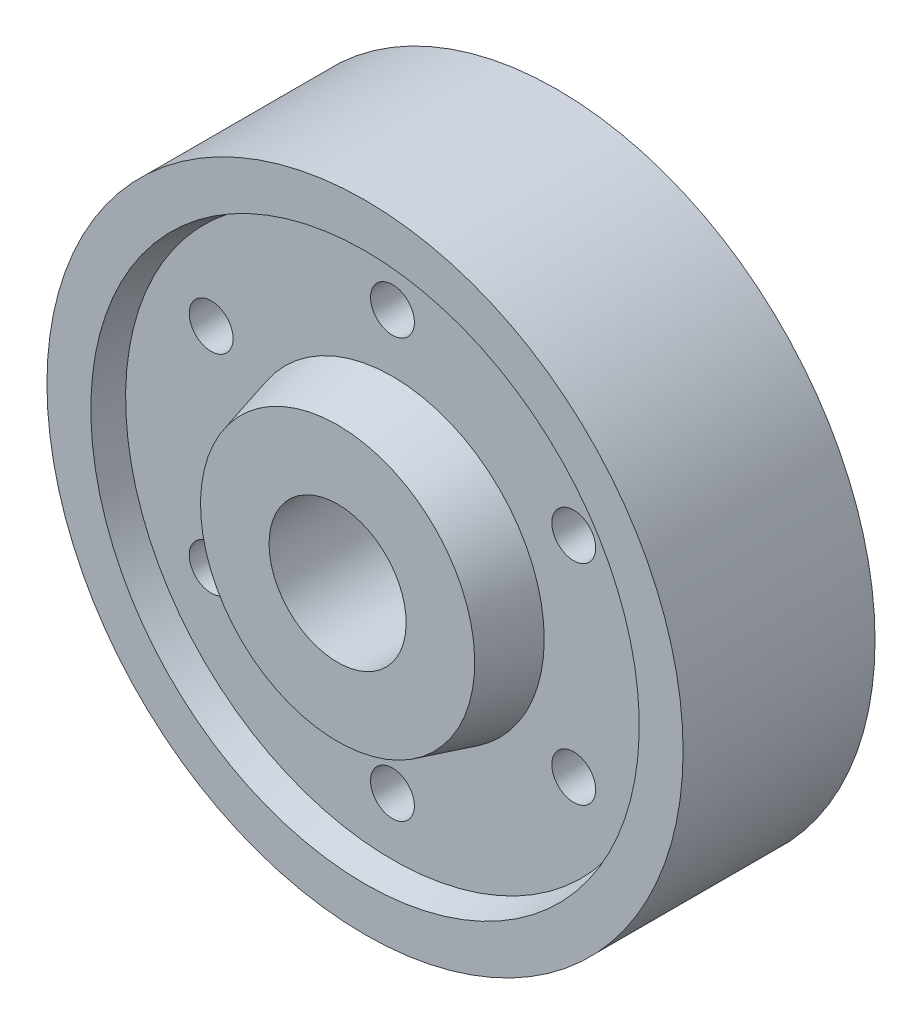
ISO-10303-21;
HEADER;
FILE_DESCRIPTION(('STEP AP214'),'2;1');
FILE_NAME('part.step','',(''),(''),'','','');
FILE_SCHEMA(('AUTOMOTIVE_DESIGN { 1 0 10303 214 1 1 1 1 }'));
ENDSEC;
DATA;
#1=APPLICATION_CONTEXT('core data for automotive mechanical design processes');
#2=APPLICATION_PROTOCOL_DEFINITION('international standard','automotive_design',2000,#1);
#3=PRODUCT_CONTEXT('',#1,'mechanical');
#4=PRODUCT('Part','Part','',(#3));
#5=PRODUCT_RELATED_PRODUCT_CATEGORY('part','',(#4));
#6=PRODUCT_DEFINITION_FORMATION('','',#4);
#7=PRODUCT_DEFINITION_CONTEXT('part definition',#1,'design');
#8=PRODUCT_DEFINITION('design','',#6,#7);
#9=PRODUCT_DEFINITION_SHAPE('','',#8);
#10=(LENGTH_UNIT() NAMED_UNIT(*) SI_UNIT(.MILLI.,.METRE.));
#11=(NAMED_UNIT(*) PLANE_ANGLE_UNIT() SI_UNIT($,.RADIAN.));
#12=(NAMED_UNIT(*) SI_UNIT($,.STERADIAN.) SOLID_ANGLE_UNIT());
#13=UNCERTAINTY_MEASURE_WITH_UNIT(LENGTH_MEASURE(1.E-05),#10,'distance_accuracy_value','');
#14=(GEOMETRIC_REPRESENTATION_CONTEXT(3) GLOBAL_UNCERTAINTY_ASSIGNED_CONTEXT((#13)) GLOBAL_UNIT_ASSIGNED_CONTEXT((#10,
#11,#12)) REPRESENTATION_CONTEXT('',''));
#15=CARTESIAN_POINT('',(0.,0.,0.));
#16=DIRECTION('',(0.,0.,1.));
#17=DIRECTION('',(1.,0.,0.));
#18=AXIS2_PLACEMENT_3D('',#15,#16,#17);
#19=CARTESIAN_POINT('',(0.,27.6794919243112,35.));
#20=DIRECTION('',(0.,0.,1.));
#21=DIRECTION('',(0.,-1.,0.));
#22=AXIS2_PLACEMENT_3D('',#19,#20,#21);
#23=PLANE('',#22);
#24=CARTESIAN_POINT('',(0.,38.1698729810778,35.));
#25=DIRECTION('',(0.,0.,1.));
#26=DIRECTION('',(1.,0.,0.));
#27=AXIS2_PLACEMENT_3D('',#24,#25,#26);
#28=CIRCLE('',#27,4.);
#29=CARTESIAN_POINT('',(4.,38.1698729810778,35.));
#30=VERTEX_POINT('',#29);
#31=EDGE_CURVE('E129',#30,#30,#28,.T.);
#32=ORIENTED_EDGE('',*,*,#31,.F.);
#33=EDGE_LOOP('',(#32));
#34=FACE_BOUND('',#33,.T.);
#35=CARTESIAN_POINT('',(-33.0560796608384,19.0849364905393,35.));
#36=DIRECTION('',(0.,0.,1.));
#37=DIRECTION('',(1.,0.,0.));
#38=AXIS2_PLACEMENT_3D('',#35,#36,#37);
#39=CIRCLE('',#38,4.);
#40=CARTESIAN_POINT('',(-29.0560796608384,19.0849364905393,35.));
#41=VERTEX_POINT('',#40);
#42=EDGE_CURVE('E133',#41,#41,#39,.T.);
#43=ORIENTED_EDGE('',*,*,#42,.F.);
#44=EDGE_LOOP('',(#43));
#45=FACE_BOUND('',#44,.T.);
#46=CARTESIAN_POINT('',(-2.66538798438892E-13,-38.1698729810778,35.));
#47=DIRECTION('',(0.,0.,1.));
#48=DIRECTION('',(1.,0.,0.));
#49=AXIS2_PLACEMENT_3D('',#46,#47,#48);
#50=CIRCLE('',#49,4.);
#51=CARTESIAN_POINT('',(3.99999999999973,-38.1698729810778,35.));
#52=VERTEX_POINT('',#51);
#53=EDGE_CURVE('E137',#52,#52,#50,.T.);
#54=ORIENTED_EDGE('',*,*,#53,.F.);
#55=EDGE_LOOP('',(#54));
#56=FACE_BOUND('',#55,.T.);
#57=CARTESIAN_POINT('',(33.0560796608386,-19.0849364905391,35.));
#58=DIRECTION('',(0.,0.,1.));
#59=DIRECTION('',(1.,0.,0.));
#60=AXIS2_PLACEMENT_3D('',#57,#58,#59);
#61=CIRCLE('',#60,4.00000000000001);
#62=CARTESIAN_POINT('',(37.0560796608386,-19.0849364905391,35.));
#63=VERTEX_POINT('',#62);
#64=EDGE_CURVE('E141',#63,#63,#61,.T.);
#65=ORIENTED_EDGE('',*,*,#64,.F.);
#66=EDGE_LOOP('',(#65));
#67=FACE_BOUND('',#66,.T.);
#68=CARTESIAN_POINT('',(33.0560796608387,19.0849364905388,35.));
#69=DIRECTION('',(0.,0.,1.));
#70=DIRECTION('',(1.,0.,0.));
#71=AXIS2_PLACEMENT_3D('',#68,#69,#70);
#72=CIRCLE('',#71,4.00000000000001);
#73=CARTESIAN_POINT('',(37.0560796608387,19.0849364905388,35.));
#74=VERTEX_POINT('',#73);
#75=EDGE_CURVE('E145',#74,#74,#72,.T.);
#76=ORIENTED_EDGE('',*,*,#75,.F.);
#77=EDGE_LOOP('',(#76));
#78=FACE_BOUND('',#77,.T.);
#79=CARTESIAN_POINT('',(-33.0560796608388,-19.0849364905386,35.));
#80=DIRECTION('',(0.,0.,1.));
#81=DIRECTION('',(1.,0.,0.));
#82=AXIS2_PLACEMENT_3D('',#79,#80,#81);
#83=CIRCLE('',#82,4.);
#84=CARTESIAN_POINT('',(-29.0560796608388,-19.0849364905386,35.));
#85=VERTEX_POINT('',#84);
#86=EDGE_CURVE('E57',#85,#85,#83,.T.);
#87=ORIENTED_EDGE('',*,*,#86,.F.);
#88=EDGE_LOOP('',(#87));
#89=FACE_BOUND('',#88,.T.);
#90=CARTESIAN_POINT('',(0.,0.,35.));
#91=DIRECTION('',(0.,0.,-1.));
#92=DIRECTION('',(0.,1.,0.));
#93=AXIS2_PLACEMENT_3D('',#90,#91,#92);
#94=CIRCLE('',#93,27.6794919243112);
#95=CARTESIAN_POINT('',(0.,27.6794919243112,35.));
#96=VERTEX_POINT('',#95);
#97=EDGE_CURVE('E70',#96,#96,#94,.T.);
#98=ORIENTED_EDGE('',*,*,#97,.T.);
#99=EDGE_LOOP('',(#98));
#100=FACE_BOUND('',#99,.T.);
#101=CARTESIAN_POINT('',(0.,0.,35.));
#102=DIRECTION('',(0.,0.,-1.));
#103=DIRECTION('',(0.,1.,0.));
#104=AXIS2_PLACEMENT_3D('',#101,#102,#103);
#105=CIRCLE('',#104,48.6602540378444);
#106=CARTESIAN_POINT('',(0.,48.6602540378444,35.));
#107=VERTEX_POINT('',#106);
#108=EDGE_CURVE('E10',#107,#107,#105,.T.);
#109=ORIENTED_EDGE('',*,*,#108,.F.);
#110=EDGE_LOOP('',(#109));
#111=FACE_BOUND('',#110,.T.);
#112=ADVANCED_FACE('F37',(#34,#45,#56,#67,#78,#89,#100,#111),#23,.T.);
#113=CARTESIAN_POINT('',(0.,0.,40.));
#114=DIRECTION('',(0.,0.,1.));
#115=DIRECTION('',(0.,-1.,0.));
#116=AXIS2_PLACEMENT_3D('',#113,#114,#115);
#117=CONICAL_SURFACE('',#116,50.,0.261799387799143);
#118=ORIENTED_EDGE('',*,*,#108,.T.);
#119=EDGE_LOOP('',(#118));
#120=FACE_BOUND('',#119,.T.);
#121=CARTESIAN_POINT('',(0.,0.,40.));
#122=DIRECTION('',(0.,0.,-1.));
#123=DIRECTION('',(0.,1.,0.));
#124=AXIS2_PLACEMENT_3D('',#121,#122,#123);
#125=CIRCLE('',#124,50.);
#126=CARTESIAN_POINT('',(0.,50.,40.));
#127=VERTEX_POINT('',#126);
#128=EDGE_CURVE('E44',#127,#127,#125,.T.);
#129=ORIENTED_EDGE('',*,*,#128,.F.);
#130=EDGE_LOOP('',(#129));
#131=FACE_BOUND('',#130,.T.);
#132=ADVANCED_FACE('F111',(#120,#131),#117,.F.);
#133=CARTESIAN_POINT('',(0.,50.,40.));
#134=DIRECTION('',(0.,0.,1.));
#135=DIRECTION('',(0.,-1.,0.));
#136=AXIS2_PLACEMENT_3D('',#133,#134,#135);
#137=PLANE('',#136);
#138=ORIENTED_EDGE('',*,*,#128,.T.);
#139=EDGE_LOOP('',(#138));
#140=FACE_BOUND('',#139,.T.);
#141=CARTESIAN_POINT('',(0.,0.,40.));
#142=DIRECTION('',(0.,0.,-1.));
#143=DIRECTION('',(0.,1.,0.));
#144=AXIS2_PLACEMENT_3D('',#141,#142,#143);
#145=CIRCLE('',#144,58.);
#146=CARTESIAN_POINT('',(0.,58.,40.));
#147=VERTEX_POINT('',#146);
#148=EDGE_CURVE('E49',#147,#147,#145,.T.);
#149=ORIENTED_EDGE('',*,*,#148,.F.);
#150=EDGE_LOOP('',(#149));
#151=FACE_BOUND('',#150,.T.);
#152=ADVANCED_FACE('F109',(#140,#151),#137,.T.);
#153=CARTESIAN_POINT('',(0.,0.,0.));
#154=DIRECTION('',(0.,0.,-1.));
#155=DIRECTION('',(0.,1.,0.));
#156=AXIS2_PLACEMENT_3D('',#153,#154,#155);
#157=CYLINDRICAL_SURFACE('',#156,58.);
#158=ORIENTED_EDGE('',*,*,#148,.T.);
#159=EDGE_LOOP('',(#158));
#160=FACE_BOUND('',#159,.T.);
#161=CARTESIAN_POINT('',(0.,0.,4.99999999999999));
#162=DIRECTION('',(0.,0.,-1.));
#163=DIRECTION('',(0.,1.,0.));
#164=AXIS2_PLACEMENT_3D('',#161,#162,#163);
#165=CIRCLE('',#164,58.);
#166=CARTESIAN_POINT('',(0.,58.,5.));
#167=VERTEX_POINT('',#166);
#168=EDGE_CURVE('E101',#167,#167,#165,.T.);
#169=ORIENTED_EDGE('',*,*,#168,.F.);
#170=EDGE_LOOP('',(#169));
#171=FACE_BOUND('',#170,.T.);
#172=ADVANCED_FACE('F106',(#160,#171),#157,.T.);
#173=CARTESIAN_POINT('',(0.,58.,5.));
#174=DIRECTION('',(0.,0.,-1.));
#175=DIRECTION('',(0.,1.,0.));
#176=AXIS2_PLACEMENT_3D('',#173,#174,#175);
#177=PLANE('',#176);
#178=ORIENTED_EDGE('',*,*,#168,.T.);
#179=EDGE_LOOP('',(#178));
#180=FACE_BOUND('',#179,.T.);
#181=CARTESIAN_POINT('',(0.,0.,4.99999999999999));
#182=DIRECTION('',(0.,0.,-1.));
#183=DIRECTION('',(0.,1.,0.));
#184=AXIS2_PLACEMENT_3D('',#181,#182,#183);
#185=CIRCLE('',#184,50.);
#186=CARTESIAN_POINT('',(0.,50.,5.));
#187=VERTEX_POINT('',#186);
#188=EDGE_CURVE('E98',#187,#187,#185,.T.);
#189=ORIENTED_EDGE('',*,*,#188,.F.);
#190=EDGE_LOOP('',(#189));
#191=FACE_BOUND('',#190,.T.);
#192=ADVANCED_FACE('F118',(#180,#191),#177,.T.);
#193=CARTESIAN_POINT('',(0.,0.,10.));
#194=DIRECTION('',(0.,0.,-1.));
#195=DIRECTION('',(0.,1.,0.));
#196=AXIS2_PLACEMENT_3D('',#193,#194,#195);
#197=CONICAL_SURFACE('',#196,48.6602540378444,0.261799387799141);
#198=ORIENTED_EDGE('',*,*,#188,.T.);
#199=EDGE_LOOP('',(#198));
#200=FACE_BOUND('',#199,.T.);
#201=CARTESIAN_POINT('',(0.,0.,10.));
#202=DIRECTION('',(0.,0.,-1.));
#203=DIRECTION('',(0.,1.,0.));
#204=AXIS2_PLACEMENT_3D('',#201,#202,#203);
#205=CIRCLE('',#204,48.6602540378444);
#206=CARTESIAN_POINT('',(0.,48.6602540378444,10.));
#207=VERTEX_POINT('',#206);
#208=EDGE_CURVE('E95',#207,#207,#205,.T.);
#209=ORIENTED_EDGE('',*,*,#208,.F.);
#210=EDGE_LOOP('',(#209));
#211=FACE_BOUND('',#210,.T.);
#212=ADVANCED_FACE('F203',(#200,#211),#197,.F.);
#213=CARTESIAN_POINT('',(0.,48.6602540378444,10.));
#214=DIRECTION('',(0.,0.,-1.));
#215=DIRECTION('',(0.,1.,0.));
#216=AXIS2_PLACEMENT_3D('',#213,#214,#215);
#217=PLANE('',#216);
#218=CARTESIAN_POINT('',(0.,38.1698729810778,10.));
#219=DIRECTION('',(0.,0.,-1.));
#220=DIRECTION('',(0.,1.,0.));
#221=AXIS2_PLACEMENT_3D('',#218,#219,#220);
#222=CIRCLE('',#221,4.);
#223=CARTESIAN_POINT('',(0.,42.1698729810778,10.));
#224=VERTEX_POINT('',#223);
#225=EDGE_CURVE('E40',#224,#224,#222,.T.);
#226=ORIENTED_EDGE('',*,*,#225,.F.);
#227=EDGE_LOOP('',(#226));
#228=FACE_BOUND('',#227,.T.);
#229=CARTESIAN_POINT('',(-33.0560796608384,19.0849364905393,10.));
#230=DIRECTION('',(0.,0.,-1.));
#231=DIRECTION('',(0.,1.,0.));
#232=AXIS2_PLACEMENT_3D('',#229,#230,#231);
#233=CIRCLE('',#232,4.);
#234=CARTESIAN_POINT('',(-33.0560796608384,23.0849364905393,10.));
#235=VERTEX_POINT('',#234);
#236=EDGE_CURVE('E65',#235,#235,#233,.T.);
#237=ORIENTED_EDGE('',*,*,#236,.F.);
#238=EDGE_LOOP('',(#237));
#239=FACE_BOUND('',#238,.T.);
#240=CARTESIAN_POINT('',(-2.66538798438892E-13,-38.1698729810778,10.));
#241=DIRECTION('',(0.,0.,-1.));
#242=DIRECTION('',(0.,1.,0.));
#243=AXIS2_PLACEMENT_3D('',#240,#241,#242);
#244=CIRCLE('',#243,4.);
#245=CARTESIAN_POINT('',(-2.66538798438892E-13,-34.1698729810778,10.));
#246=VERTEX_POINT('',#245);
#247=EDGE_CURVE('E63',#246,#246,#244,.T.);
#248=ORIENTED_EDGE('',*,*,#247,.F.);
#249=EDGE_LOOP('',(#248));
#250=FACE_BOUND('',#249,.T.);
#251=CARTESIAN_POINT('',(33.0560796608386,-19.0849364905391,10.));
#252=DIRECTION('',(0.,0.,-1.));
#253=DIRECTION('',(0.,1.,0.));
#254=AXIS2_PLACEMENT_3D('',#251,#252,#253);
#255=CIRCLE('',#254,4.00000000000001);
#256=CARTESIAN_POINT('',(33.0560796608386,-15.0849364905391,10.));
#257=VERTEX_POINT('',#256);
#258=EDGE_CURVE('E60',#257,#257,#255,.T.);
#259=ORIENTED_EDGE('',*,*,#258,.F.);
#260=EDGE_LOOP('',(#259));
#261=FACE_BOUND('',#260,.T.);
#262=CARTESIAN_POINT('',(33.0560796608387,19.0849364905388,10.));
#263=DIRECTION('',(0.,0.,-1.));
#264=DIRECTION('',(0.,1.,0.));
#265=AXIS2_PLACEMENT_3D('',#262,#263,#264);
#266=CIRCLE('',#265,4.00000000000001);
#267=CARTESIAN_POINT('',(33.0560796608387,23.0849364905388,10.));
#268=VERTEX_POINT('',#267);
#269=EDGE_CURVE('E56',#268,#268,#266,.T.);
#270=ORIENTED_EDGE('',*,*,#269,.F.);
#271=EDGE_LOOP('',(#270));
#272=FACE_BOUND('',#271,.T.);
#273=CARTESIAN_POINT('',(-33.0560796608388,-19.0849364905386,10.));
#274=DIRECTION('',(0.,0.,-1.));
#275=DIRECTION('',(0.,1.,0.));
#276=AXIS2_PLACEMENT_3D('',#273,#274,#275);
#277=CIRCLE('',#276,4.);
#278=CARTESIAN_POINT('',(-33.0560796608388,-15.0849364905386,10.));
#279=VERTEX_POINT('',#278);
#280=EDGE_CURVE('E53',#279,#279,#277,.T.);
#281=ORIENTED_EDGE('',*,*,#280,.F.);
#282=EDGE_LOOP('',(#281));
#283=FACE_BOUND('',#282,.T.);
#284=ORIENTED_EDGE('',*,*,#208,.T.);
#285=EDGE_LOOP('',(#284));
#286=FACE_BOUND('',#285,.T.);
#287=CARTESIAN_POINT('',(0.,0.,10.));
#288=DIRECTION('',(0.,0.,-1.));
#289=DIRECTION('',(0.,1.,0.));
#290=AXIS2_PLACEMENT_3D('',#287,#288,#289);
#291=CIRCLE('',#290,27.6794919243112);
#292=CARTESIAN_POINT('',(0.,27.6794919243112,10.));
#293=VERTEX_POINT('',#292);
#294=EDGE_CURVE('E92',#293,#293,#291,.T.);
#295=ORIENTED_EDGE('',*,*,#294,.F.);
#296=EDGE_LOOP('',(#295));
#297=FACE_BOUND('',#296,.T.);
#298=ADVANCED_FACE('F200',(#228,#239,#250,#261,#272,#283,#286,#297),#217,.T.);
#299=CARTESIAN_POINT('',(0.,0.,0.));
#300=DIRECTION('',(0.,0.,1.));
#301=DIRECTION('',(0.,-1.,0.));
#302=AXIS2_PLACEMENT_3D('',#299,#300,#301);
#303=CONICAL_SURFACE('',#302,25.,0.26179938779915);
#304=ORIENTED_EDGE('',*,*,#294,.T.);
#305=EDGE_LOOP('',(#304));
#306=FACE_BOUND('',#305,.T.);
#307=CARTESIAN_POINT('',(0.,0.,0.));
#308=DIRECTION('',(0.,0.,-1.));
#309=DIRECTION('',(0.,1.,0.));
#310=AXIS2_PLACEMENT_3D('',#307,#308,#309);
#311=CIRCLE('',#310,25.);
#312=CARTESIAN_POINT('',(0.,25.,0.));
#313=VERTEX_POINT('',#312);
#314=EDGE_CURVE('E89',#313,#313,#311,.T.);
#315=ORIENTED_EDGE('',*,*,#314,.F.);
#316=EDGE_LOOP('',(#315));
#317=FACE_BOUND('',#316,.T.);
#318=ADVANCED_FACE('F196',(#306,#317),#303,.T.);
#319=CARTESIAN_POINT('',(0.,25.,0.));
#320=DIRECTION('',(0.,0.,-1.));
#321=DIRECTION('',(0.,1.,0.));
#322=AXIS2_PLACEMENT_3D('',#319,#320,#321);
#323=PLANE('',#322);
#324=ORIENTED_EDGE('',*,*,#314,.T.);
#325=EDGE_LOOP('',(#324));
#326=FACE_BOUND('',#325,.T.);
#327=CARTESIAN_POINT('',(0.,0.,0.));
#328=DIRECTION('',(0.,0.,-1.));
#329=DIRECTION('',(0.,1.,0.));
#330=AXIS2_PLACEMENT_3D('',#327,#328,#329);
#331=CIRCLE('',#330,12.5);
#332=CARTESIAN_POINT('',(0.,12.5,0.));
#333=VERTEX_POINT('',#332);
#334=EDGE_CURVE('E86',#333,#333,#331,.T.);
#335=ORIENTED_EDGE('',*,*,#334,.F.);
#336=EDGE_LOOP('',(#335));
#337=FACE_BOUND('',#336,.T.);
#338=ADVANCED_FACE('F192',(#326,#337),#323,.T.);
#339=CARTESIAN_POINT('',(0.,0.,0.));
#340=DIRECTION('',(0.,0.,-1.));
#341=DIRECTION('',(0.,1.,0.));
#342=AXIS2_PLACEMENT_3D('',#339,#340,#341);
#343=CYLINDRICAL_SURFACE('',#342,12.5);
#344=ORIENTED_EDGE('',*,*,#334,.T.);
#345=EDGE_LOOP('',(#344));
#346=FACE_BOUND('',#345,.T.);
#347=CARTESIAN_POINT('',(0.,0.,45.));
#348=DIRECTION('',(0.,0.,-1.));
#349=DIRECTION('',(0.,1.,0.));
#350=AXIS2_PLACEMENT_3D('',#347,#348,#349);
#351=CIRCLE('',#350,12.5);
#352=CARTESIAN_POINT('',(0.,12.5,45.));
#353=VERTEX_POINT('',#352);
#354=EDGE_CURVE('E79',#353,#353,#351,.T.);
#355=ORIENTED_EDGE('',*,*,#354,.F.);
#356=EDGE_LOOP('',(#355));
#357=FACE_BOUND('',#356,.T.);
#358=ADVANCED_FACE('F188',(#346,#357),#343,.F.);
#359=CARTESIAN_POINT('',(0.,12.5,45.));
#360=DIRECTION('',(0.,0.,1.));
#361=DIRECTION('',(0.,-1.,0.));
#362=AXIS2_PLACEMENT_3D('',#359,#360,#361);
#363=PLANE('',#362);
#364=ORIENTED_EDGE('',*,*,#354,.T.);
#365=EDGE_LOOP('',(#364));
#366=FACE_BOUND('',#365,.T.);
#367=CARTESIAN_POINT('',(0.,0.,45.));
#368=DIRECTION('',(0.,0.,-1.));
#369=DIRECTION('',(0.,1.,0.));
#370=AXIS2_PLACEMENT_3D('',#367,#368,#369);
#371=CIRCLE('',#370,25.);
#372=CARTESIAN_POINT('',(0.,25.,45.));
#373=VERTEX_POINT('',#372);
#374=EDGE_CURVE('E74',#373,#373,#371,.T.);
#375=ORIENTED_EDGE('',*,*,#374,.F.);
#376=EDGE_LOOP('',(#375));
#377=FACE_BOUND('',#376,.T.);
#378=ADVANCED_FACE('F184',(#366,#377),#363,.T.);
#379=CARTESIAN_POINT('',(0.,0.,35.));
#380=DIRECTION('',(0.,0.,-1.));
#381=DIRECTION('',(0.,1.,0.));
#382=AXIS2_PLACEMENT_3D('',#379,#380,#381);
#383=CONICAL_SURFACE('',#382,27.6794919243112,0.26179938779915);
#384=ORIENTED_EDGE('',*,*,#374,.T.);
#385=EDGE_LOOP('',(#384));
#386=FACE_BOUND('',#385,.T.);
#387=ORIENTED_EDGE('',*,*,#97,.F.);
#388=EDGE_LOOP('',(#387));
#389=FACE_BOUND('',#388,.T.);
#390=ADVANCED_FACE('F170',(#386,#389),#383,.T.);
#391=CARTESIAN_POINT('',(-33.0560796608388,-19.0849364905386,-15.));
#392=DIRECTION('',(0.,0.,1.));
#393=DIRECTION('',(1.,0.,0.));
#394=AXIS2_PLACEMENT_3D('',#391,#392,#393);
#395=CYLINDRICAL_SURFACE('',#394,4.);
#396=ORIENTED_EDGE('',*,*,#280,.T.);
#397=EDGE_LOOP('',(#396));
#398=FACE_BOUND('',#397,.T.);
#399=ORIENTED_EDGE('',*,*,#86,.T.);
#400=EDGE_LOOP('',(#399));
#401=FACE_BOUND('',#400,.T.);
#402=ADVANCED_FACE('F160',(#398,#401),#395,.F.);
#403=CARTESIAN_POINT('',(33.0560796608387,19.0849364905388,-15.));
#404=DIRECTION('',(0.,0.,1.));
#405=DIRECTION('',(1.,0.,0.));
#406=AXIS2_PLACEMENT_3D('',#403,#404,#405);
#407=CYLINDRICAL_SURFACE('',#406,4.00000000000001);
#408=ORIENTED_EDGE('',*,*,#269,.T.);
#409=EDGE_LOOP('',(#408));
#410=FACE_BOUND('',#409,.T.);
#411=ORIENTED_EDGE('',*,*,#75,.T.);
#412=EDGE_LOOP('',(#411));
#413=FACE_BOUND('',#412,.T.);
#414=ADVANCED_FACE('F157',(#410,#413),#407,.F.);
#415=CARTESIAN_POINT('',(33.0560796608386,-19.0849364905391,-15.));
#416=DIRECTION('',(0.,0.,1.));
#417=DIRECTION('',(1.,0.,0.));
#418=AXIS2_PLACEMENT_3D('',#415,#416,#417);
#419=CYLINDRICAL_SURFACE('',#418,4.00000000000001);
#420=ORIENTED_EDGE('',*,*,#258,.T.);
#421=EDGE_LOOP('',(#420));
#422=FACE_BOUND('',#421,.T.);
#423=ORIENTED_EDGE('',*,*,#64,.T.);
#424=EDGE_LOOP('',(#423));
#425=FACE_BOUND('',#424,.T.);
#426=ADVANCED_FACE('F159',(#422,#425),#419,.F.);
#427=CARTESIAN_POINT('',(-2.66538798438892E-13,-38.1698729810778,-15.));
#428=DIRECTION('',(0.,0.,1.));
#429=DIRECTION('',(1.,0.,0.));
#430=AXIS2_PLACEMENT_3D('',#427,#428,#429);
#431=CYLINDRICAL_SURFACE('',#430,4.);
#432=ORIENTED_EDGE('',*,*,#247,.T.);
#433=EDGE_LOOP('',(#432));
#434=FACE_BOUND('',#433,.T.);
#435=ORIENTED_EDGE('',*,*,#53,.T.);
#436=EDGE_LOOP('',(#435));
#437=FACE_BOUND('',#436,.T.);
#438=ADVANCED_FACE('F167',(#434,#437),#431,.F.);
#439=CARTESIAN_POINT('',(-33.0560796608384,19.0849364905393,-15.));
#440=DIRECTION('',(0.,0.,1.));
#441=DIRECTION('',(1.,0.,0.));
#442=AXIS2_PLACEMENT_3D('',#439,#440,#441);
#443=CYLINDRICAL_SURFACE('',#442,4.);
#444=ORIENTED_EDGE('',*,*,#236,.T.);
#445=EDGE_LOOP('',(#444));
#446=FACE_BOUND('',#445,.T.);
#447=ORIENTED_EDGE('',*,*,#42,.T.);
#448=EDGE_LOOP('',(#447));
#449=FACE_BOUND('',#448,.T.);
#450=ADVANCED_FACE('F177',(#446,#449),#443,.F.);
#451=CARTESIAN_POINT('',(0.,38.1698729810778,-15.));
#452=DIRECTION('',(0.,0.,1.));
#453=DIRECTION('',(1.,0.,0.));
#454=AXIS2_PLACEMENT_3D('',#451,#452,#453);
#455=CYLINDRICAL_SURFACE('',#454,4.);
#456=ORIENTED_EDGE('',*,*,#225,.T.);
#457=EDGE_LOOP('',(#456));
#458=FACE_BOUND('',#457,.T.);
#459=ORIENTED_EDGE('',*,*,#31,.T.);
#460=EDGE_LOOP('',(#459));
#461=FACE_BOUND('',#460,.T.);
#462=ADVANCED_FACE('F174',(#458,#461),#455,.F.);
#463=CLOSED_SHELL('',(#112,#132,#152,#172,#192,#212,#298,#318,#338,#358,#378,#390,#402,#414,
#426,#438,#450,#462));
#464=MANIFOLD_SOLID_BREP('B2',#463);
#465=ADVANCED_BREP_SHAPE_REPRESENTATION('',(#18,#464),#14);
#466=SHAPE_DEFINITION_REPRESENTATION(#9,#465);
ENDSEC;
END-ISO-10303-21;
